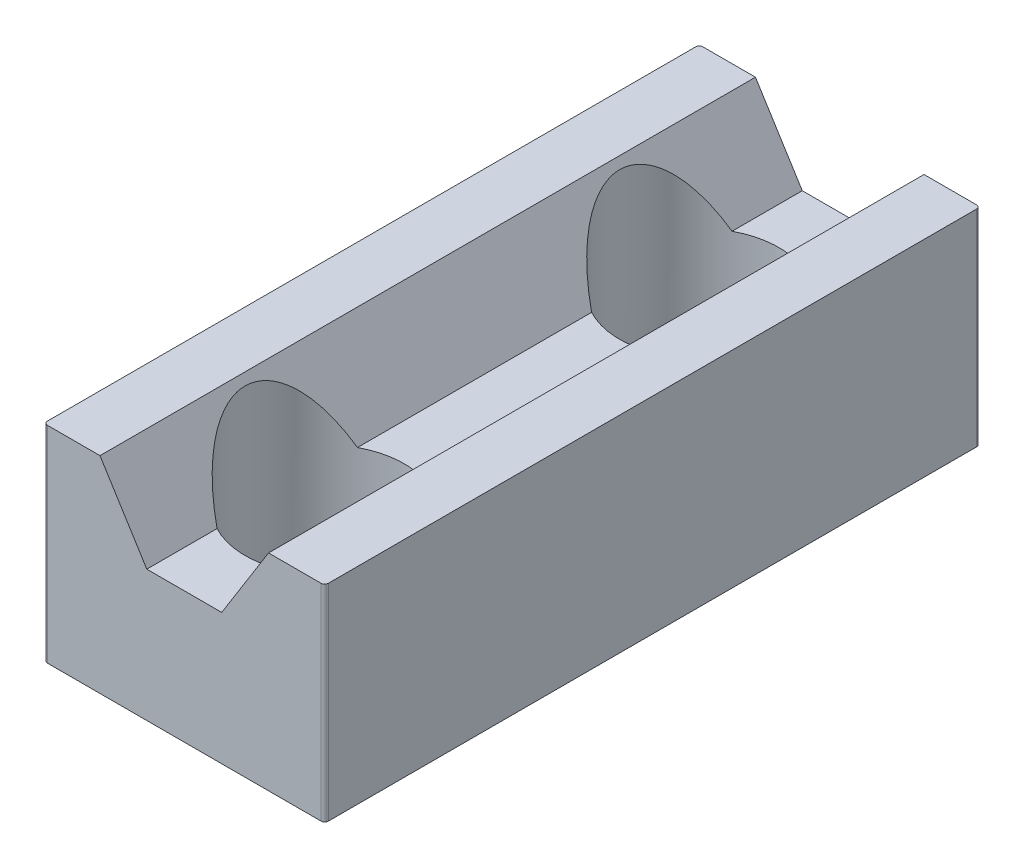
ISO-10303-21;
HEADER;
FILE_DESCRIPTION(('STEP AP214'),'2;1');
FILE_NAME('part.step','',(''),(''),'','','');
FILE_SCHEMA(('AUTOMOTIVE_DESIGN { 1 0 10303 214 1 1 1 1 }'));
ENDSEC;
DATA;
#1=APPLICATION_CONTEXT('core data for automotive mechanical design processes');
#2=APPLICATION_PROTOCOL_DEFINITION('international standard','automotive_design',2000,#1);
#3=PRODUCT_CONTEXT('',#1,'mechanical');
#4=PRODUCT('Part','Part','',(#3));
#5=PRODUCT_RELATED_PRODUCT_CATEGORY('part','',(#4));
#6=PRODUCT_DEFINITION_FORMATION('','',#4);
#7=PRODUCT_DEFINITION_CONTEXT('part definition',#1,'design');
#8=PRODUCT_DEFINITION('design','',#6,#7);
#9=PRODUCT_DEFINITION_SHAPE('','',#8);
#10=(LENGTH_UNIT() NAMED_UNIT(*) SI_UNIT(.MILLI.,.METRE.));
#11=(NAMED_UNIT(*) PLANE_ANGLE_UNIT() SI_UNIT($,.RADIAN.));
#12=(NAMED_UNIT(*) SI_UNIT($,.STERADIAN.) SOLID_ANGLE_UNIT());
#13=UNCERTAINTY_MEASURE_WITH_UNIT(LENGTH_MEASURE(1.E-05),#10,'distance_accuracy_value','');
#14=(GEOMETRIC_REPRESENTATION_CONTEXT(3) GLOBAL_UNCERTAINTY_ASSIGNED_CONTEXT((#13)) GLOBAL_UNIT_ASSIGNED_CONTEXT((#10,
#11,#12)) REPRESENTATION_CONTEXT('',''));
#15=CARTESIAN_POINT('',(0.,0.,0.));
#16=DIRECTION('',(0.,0.,1.));
#17=DIRECTION('',(1.,0.,0.));
#18=AXIS2_PLACEMENT_3D('',#15,#16,#17);
#19=CARTESIAN_POINT('',(0.,0.,0.));
#20=DIRECTION('',(0.,1.,0.));
#21=DIRECTION('',(1.,0.,0.));
#22=AXIS2_PLACEMENT_3D('',#19,#20,#21);
#23=PLANE('',#22);
#24=CARTESIAN_POINT('',(0.,0.,10.));
#25=DIRECTION('',(0.,1.,0.));
#26=DIRECTION('',(1.,0.,0.));
#27=AXIS2_PLACEMENT_3D('',#24,#25,#26);
#28=CIRCLE('',#27,2.75);
#29=CARTESIAN_POINT('',(-2.75,0.,10.));
#30=VERTEX_POINT('',#29);
#31=EDGE_CURVE('E25',#30,#30,#28,.T.);
#32=ORIENTED_EDGE('',*,*,#31,.T.);
#33=EDGE_LOOP('',(#32));
#34=FACE_BOUND('',#33,.T.);
#35=CARTESIAN_POINT('',(0.,0.,-10.));
#36=DIRECTION('',(0.,1.,0.));
#37=DIRECTION('',(1.,0.,0.));
#38=AXIS2_PLACEMENT_3D('',#35,#36,#37);
#39=CIRCLE('',#38,2.75);
#40=CARTESIAN_POINT('',(-2.75,0.,-10.));
#41=VERTEX_POINT('',#40);
#42=EDGE_CURVE('E257',#41,#41,#39,.T.);
#43=ORIENTED_EDGE('',*,*,#42,.T.);
#44=EDGE_LOOP('',(#43));
#45=FACE_BOUND('',#44,.T.);
#46=CARTESIAN_POINT('',(-7.3,0.,-17.3));
#47=DIRECTION('',(0.,1.,0.));
#48=DIRECTION('',(-0.707106781186548,0.,-0.707106781186548));
#49=AXIS2_PLACEMENT_3D('',#46,#47,#48);
#50=CIRCLE('',#49,0.2);
#51=CARTESIAN_POINT('',(-7.3,0.,-17.5));
#52=VERTEX_POINT('',#51);
#53=CARTESIAN_POINT('',(-7.5,0.,-17.3));
#54=VERTEX_POINT('',#53);
#55=EDGE_CURVE('E214',#52,#54,#50,.T.);
#56=ORIENTED_EDGE('',*,*,#55,.F.);
#57=DIRECTION('',(-1.,0.,0.));
#58=VECTOR('',#57,1.);
#59=CARTESIAN_POINT('',(7.5,0.,-17.5));
#60=LINE('',#59,#58);
#61=CARTESIAN_POINT('',(7.3,0.,-17.5));
#62=VERTEX_POINT('',#61);
#63=EDGE_CURVE('E198',#62,#52,#60,.T.);
#64=ORIENTED_EDGE('',*,*,#63,.F.);
#65=CARTESIAN_POINT('',(7.3,0.,-17.3));
#66=DIRECTION('',(0.,1.,0.));
#67=DIRECTION('',(0.707106781186548,0.,-0.707106781186548));
#68=AXIS2_PLACEMENT_3D('',#65,#66,#67);
#69=CIRCLE('',#68,0.2);
#70=CARTESIAN_POINT('',(7.5,0.,-17.3));
#71=VERTEX_POINT('',#70);
#72=EDGE_CURVE('E298',#71,#62,#69,.T.);
#73=ORIENTED_EDGE('',*,*,#72,.F.);
#74=DIRECTION('',(0.,0.,-1.));
#75=VECTOR('',#74,1.);
#76=CARTESIAN_POINT('',(7.5,0.,17.5));
#77=LINE('',#76,#75);
#78=CARTESIAN_POINT('',(7.5,0.,17.3));
#79=VERTEX_POINT('',#78);
#80=EDGE_CURVE('E305',#79,#71,#77,.T.);
#81=ORIENTED_EDGE('',*,*,#80,.F.);
#82=CARTESIAN_POINT('',(7.3,0.,17.3));
#83=DIRECTION('',(0.,1.,0.));
#84=DIRECTION('',(0.707106781186548,0.,0.707106781186548));
#85=AXIS2_PLACEMENT_3D('',#82,#83,#84);
#86=CIRCLE('',#85,0.2);
#87=CARTESIAN_POINT('',(7.3,0.,17.5));
#88=VERTEX_POINT('',#87);
#89=EDGE_CURVE('E265',#88,#79,#86,.T.);
#90=ORIENTED_EDGE('',*,*,#89,.F.);
#91=DIRECTION('',(1.,0.,0.));
#92=VECTOR('',#91,1.);
#93=CARTESIAN_POINT('',(-7.5,0.,17.5));
#94=LINE('',#93,#92);
#95=CARTESIAN_POINT('',(-7.3,0.,17.5));
#96=VERTEX_POINT('',#95);
#97=EDGE_CURVE('E285',#96,#88,#94,.T.);
#98=ORIENTED_EDGE('',*,*,#97,.F.);
#99=CARTESIAN_POINT('',(-7.3,0.,17.3));
#100=DIRECTION('',(0.,1.,0.));
#101=DIRECTION('',(-0.707106781186548,0.,0.707106781186548));
#102=AXIS2_PLACEMENT_3D('',#99,#100,#101);
#103=CIRCLE('',#102,0.2);
#104=CARTESIAN_POINT('',(-7.5,0.,17.3));
#105=VERTEX_POINT('',#104);
#106=EDGE_CURVE('E286',#105,#96,#103,.T.);
#107=ORIENTED_EDGE('',*,*,#106,.F.);
#108=DIRECTION('',(0.,0.,1.));
#109=VECTOR('',#108,1.);
#110=CARTESIAN_POINT('',(-7.5,0.,-17.5));
#111=LINE('',#110,#109);
#112=EDGE_CURVE('E11',#54,#105,#111,.T.);
#113=ORIENTED_EDGE('',*,*,#112,.F.);
#114=EDGE_LOOP('',(#56,#64,#73,#81,#90,#98,#107,#113));
#115=FACE_BOUND('',#114,.T.);
#116=ADVANCED_FACE('F17',(#34,#45,#115),#23,.F.);
#117=CARTESIAN_POINT('',(-7.5,0.,-17.5));
#118=DIRECTION('',(-1.,0.,0.));
#119=DIRECTION('',(0.,1.,0.));
#120=AXIS2_PLACEMENT_3D('',#117,#118,#119);
#121=PLANE('',#120);
#122=DIRECTION('',(0.,1.,0.));
#123=VECTOR('',#122,1.);
#124=CARTESIAN_POINT('',(-7.5,0.,-17.3));
#125=LINE('',#124,#123);
#126=CARTESIAN_POINT('',(-7.5,11.,-17.3));
#127=VERTEX_POINT('',#126);
#128=EDGE_CURVE('E220',#54,#127,#125,.T.);
#129=ORIENTED_EDGE('',*,*,#128,.F.);
#130=ORIENTED_EDGE('',*,*,#112,.T.);
#131=DIRECTION('',(0.,-1.,0.));
#132=VECTOR('',#131,1.);
#133=CARTESIAN_POINT('',(-7.5,0.,17.3));
#134=LINE('',#133,#132);
#135=CARTESIAN_POINT('',(-7.5,11.,17.3));
#136=VERTEX_POINT('',#135);
#137=EDGE_CURVE('E323',#136,#105,#134,.T.);
#138=ORIENTED_EDGE('',*,*,#137,.F.);
#139=DIRECTION('',(0.,0.,1.));
#140=VECTOR('',#139,1.);
#141=CARTESIAN_POINT('',(-7.5,11.,-17.5));
#142=LINE('',#141,#140);
#143=EDGE_CURVE('E211',#127,#136,#142,.T.);
#144=ORIENTED_EDGE('',*,*,#143,.F.);
#145=EDGE_LOOP('',(#129,#130,#138,#144));
#146=FACE_BOUND('',#145,.T.);
#147=ADVANCED_FACE('F880',(#146),#121,.T.);
#148=CARTESIAN_POINT('',(2.,7.,17.5));
#149=DIRECTION('',(0.,-1.,0.));
#150=DIRECTION('',(0.,0.,-1.));
#151=AXIS2_PLACEMENT_3D('',#148,#149,#150);
#152=PLANE('',#151);
#153=CARTESIAN_POINT('',(0.,7.,10.));
#154=DIRECTION('',(0.,-1.,0.));
#155=DIRECTION('',(1.,0.,0.));
#156=AXIS2_PLACEMENT_3D('',#153,#154,#155);
#157=CIRCLE('',#156,4.25);
#158=CARTESIAN_POINT('',(2.,7.,13.75));
#159=VERTEX_POINT('',#158);
#160=CARTESIAN_POINT('',(-2.,7.,13.75));
#161=VERTEX_POINT('',#160);
#162=EDGE_CURVE('E413',#159,#161,#157,.T.);
#163=ORIENTED_EDGE('',*,*,#162,.T.);
#164=DIRECTION('',(0.,0.,-1.));
#165=VECTOR('',#164,1.);
#166=CARTESIAN_POINT('',(-2.,7.,17.5));
#167=LINE('',#166,#165);
#168=CARTESIAN_POINT('',(-2.,7.,17.5));
#169=VERTEX_POINT('',#168);
#170=EDGE_CURVE('E324',#169,#161,#167,.T.);
#171=ORIENTED_EDGE('',*,*,#170,.F.);
#172=DIRECTION('',(-1.,0.,0.));
#173=VECTOR('',#172,1.);
#174=CARTESIAN_POINT('',(-2.75,7.,17.5));
#175=LINE('',#174,#173);
#176=CARTESIAN_POINT('',(2.,7.,17.5));
#177=VERTEX_POINT('',#176);
#178=EDGE_CURVE('E345',#177,#169,#175,.T.);
#179=ORIENTED_EDGE('',*,*,#178,.F.);
#180=DIRECTION('',(0.,0.,-1.));
#181=VECTOR('',#180,1.);
#182=CARTESIAN_POINT('',(2.,7.,17.5));
#183=LINE('',#182,#181);
#184=EDGE_CURVE('E239',#177,#159,#183,.T.);
#185=ORIENTED_EDGE('',*,*,#184,.T.);
#186=EDGE_LOOP('',(#163,#171,#179,#185));
#187=FACE_BOUND('',#186,.T.);
#188=ADVANCED_FACE('F870',(#187),#152,.F.);
#189=CARTESIAN_POINT('',(0.,11.,10.));
#190=DIRECTION('',(0.,-1.,0.));
#191=DIRECTION('',(1.,0.,0.));
#192=AXIS2_PLACEMENT_3D('',#189,#190,#191);
#193=CYLINDRICAL_SURFACE('',#192,2.75);
#194=CARTESIAN_POINT('',(0.,2.,10.));
#195=DIRECTION('',(0.,1.,0.));
#196=DIRECTION('',(1.,0.,0.));
#197=AXIS2_PLACEMENT_3D('',#194,#195,#196);
#198=CIRCLE('',#197,2.75);
#199=CARTESIAN_POINT('',(-2.75,2.,10.));
#200=VERTEX_POINT('',#199);
#201=EDGE_CURVE('E353',#200,#200,#198,.T.);
#202=ORIENTED_EDGE('',*,*,#201,.T.);
#203=DIRECTION('',(0.,-1.,0.));
#204=VECTOR('',#203,1.);
#205=CARTESIAN_POINT('',(-2.75,11.,10.));
#206=LINE('',#205,#204);
#207=EDGE_CURVE('E42',#200,#30,#206,.T.);
#208=ORIENTED_EDGE('',*,*,#207,.T.);
#209=ORIENTED_EDGE('',*,*,#31,.F.);
#210=ORIENTED_EDGE('',*,*,#207,.F.);
#211=EDGE_LOOP('',(#202,#208,#209,#210));
#212=FACE_BOUND('',#211,.T.);
#213=ADVANCED_FACE('F823',(#212),#193,.F.);
#214=CARTESIAN_POINT('',(0.,2.,10.));
#215=DIRECTION('',(0.,1.,0.));
#216=DIRECTION('',(1.,0.,0.));
#217=AXIS2_PLACEMENT_3D('',#214,#215,#216);
#218=PLANE('',#217);
#219=ORIENTED_EDGE('',*,*,#201,.F.);
#220=EDGE_LOOP('',(#219));
#221=FACE_BOUND('',#220,.T.);
#222=CARTESIAN_POINT('',(0.,2.,10.));
#223=DIRECTION('',(0.,-1.,0.));
#224=DIRECTION('',(1.,0.,0.));
#225=AXIS2_PLACEMENT_3D('',#222,#223,#224);
#226=CIRCLE('',#225,4.25);
#227=CARTESIAN_POINT('',(-4.25,2.,10.));
#228=VERTEX_POINT('',#227);
#229=EDGE_CURVE('E410',#228,#228,#226,.T.);
#230=ORIENTED_EDGE('',*,*,#229,.F.);
#231=EDGE_LOOP('',(#230));
#232=FACE_BOUND('',#231,.T.);
#233=ADVANCED_FACE('F818',(#221,#232),#218,.T.);
#234=CARTESIAN_POINT('',(0.,11.,10.));
#235=DIRECTION('',(0.,-1.,0.));
#236=DIRECTION('',(1.,0.,0.));
#237=AXIS2_PLACEMENT_3D('',#234,#235,#236);
#238=CYLINDRICAL_SURFACE('',#237,4.25);
#239=CARTESIAN_POINT('',(0.,3.8,10.));
#240=DIRECTION('',(0.847998304005088,-0.529998940003179,0.));
#241=DIRECTION('',(0.529998940003179,0.847998304005088,0.));
#242=AXIS2_PLACEMENT_3D('',#239,#240,#241);
#243=ELLIPSE('',#242,8.01888396224812,4.25);
#244=CARTESIAN_POINT('',(2.,7.,6.25));
#245=VERTEX_POINT('',#244);
#246=EDGE_CURVE('E244',#245,#159,#243,.T.);
#247=ORIENTED_EDGE('',*,*,#246,.F.);
#248=CARTESIAN_POINT('',(0.,7.,10.));
#249=DIRECTION('',(0.,-1.,0.));
#250=DIRECTION('',(1.,0.,0.));
#251=AXIS2_PLACEMENT_3D('',#248,#249,#250);
#252=CIRCLE('',#251,4.25);
#253=CARTESIAN_POINT('',(-2.,7.,6.25));
#254=VERTEX_POINT('',#253);
#255=EDGE_CURVE('E395',#254,#245,#252,.T.);
#256=ORIENTED_EDGE('',*,*,#255,.F.);
#257=CARTESIAN_POINT('',(0.,3.8,10.));
#258=DIRECTION('',(-0.847998304005088,-0.52999894000318,0.));
#259=DIRECTION('',(0.52999894000318,-0.847998304005088,0.));
#260=AXIS2_PLACEMENT_3D('',#257,#258,#259);
#261=ELLIPSE('',#260,8.01888396224811,4.25);
#262=CARTESIAN_POINT('',(-4.25,10.6,10.));
#263=VERTEX_POINT('',#262);
#264=EDGE_CURVE('E403',#263,#254,#261,.T.);
#265=ORIENTED_EDGE('',*,*,#264,.F.);
#266=DIRECTION('',(0.,-1.,0.));
#267=VECTOR('',#266,1.);
#268=CARTESIAN_POINT('',(-4.25,11.,10.));
#269=LINE('',#268,#267);
#270=EDGE_CURVE('E406',#263,#228,#269,.T.);
#271=ORIENTED_EDGE('',*,*,#270,.T.);
#272=ORIENTED_EDGE('',*,*,#229,.T.);
#273=ORIENTED_EDGE('',*,*,#270,.F.);
#274=CARTESIAN_POINT('',(0.,3.8,10.));
#275=DIRECTION('',(-0.847998304005088,-0.52999894000318,0.));
#276=DIRECTION('',(0.52999894000318,-0.847998304005088,0.));
#277=AXIS2_PLACEMENT_3D('',#274,#275,#276);
#278=ELLIPSE('',#277,8.01888396224811,4.25);
#279=EDGE_CURVE('E328',#161,#263,#278,.T.);
#280=ORIENTED_EDGE('',*,*,#279,.F.);
#281=ORIENTED_EDGE('',*,*,#162,.F.);
#282=EDGE_LOOP('',(#247,#256,#265,#271,#272,#273,#280,#281));
#283=FACE_BOUND('',#282,.T.);
#284=ADVANCED_FACE('F788',(#283),#238,.F.);
#285=CARTESIAN_POINT('',(-2.,7.,17.5));
#286=DIRECTION('',(-0.847998304005088,-0.52999894000318,0.));
#287=DIRECTION('',(-0.52999894000318,0.847998304005088,0.));
#288=AXIS2_PLACEMENT_3D('',#285,#286,#287);
#289=PLANE('',#288);
#290=CARTESIAN_POINT('',(0.,3.8,-10.));
#291=DIRECTION('',(-0.847998304005088,-0.52999894000318,0.));
#292=DIRECTION('',(0.52999894000318,-0.847998304005088,0.));
#293=AXIS2_PLACEMENT_3D('',#290,#291,#292);
#294=ELLIPSE('',#293,8.01888396224811,4.25);
#295=CARTESIAN_POINT('',(-2.,7.,-6.25));
#296=VERTEX_POINT('',#295);
#297=CARTESIAN_POINT('',(-4.25,10.6,-10.));
#298=VERTEX_POINT('',#297);
#299=EDGE_CURVE('E268',#296,#298,#294,.T.);
#300=ORIENTED_EDGE('',*,*,#299,.T.);
#301=CARTESIAN_POINT('',(0.,3.8,-10.));
#302=DIRECTION('',(-0.847998304005088,-0.52999894000318,0.));
#303=DIRECTION('',(0.52999894000318,-0.847998304005088,0.));
#304=AXIS2_PLACEMENT_3D('',#301,#302,#303);
#305=ELLIPSE('',#304,8.01888396224811,4.25);
#306=CARTESIAN_POINT('',(-2.,7.,-13.75));
#307=VERTEX_POINT('',#306);
#308=EDGE_CURVE('E369',#298,#307,#305,.T.);
#309=ORIENTED_EDGE('',*,*,#308,.T.);
#310=DIRECTION('',(0.,0.,-1.));
#311=VECTOR('',#310,1.);
#312=CARTESIAN_POINT('',(-2.,7.,17.5));
#313=LINE('',#312,#311);
#314=CARTESIAN_POINT('',(-2.,7.,-17.5));
#315=VERTEX_POINT('',#314);
#316=EDGE_CURVE('E329',#307,#315,#313,.T.);
#317=ORIENTED_EDGE('',*,*,#316,.T.);
#318=DIRECTION('',(0.52999894000318,-0.847998304005088,0.));
#319=VECTOR('',#318,1.);
#320=CARTESIAN_POINT('',(0.907303370786518,2.34831460674157,-17.5));
#321=LINE('',#320,#319);
#322=CARTESIAN_POINT('',(-4.5,11.,-17.5));
#323=VERTEX_POINT('',#322);
#324=EDGE_CURVE('E238',#323,#315,#321,.T.);
#325=ORIENTED_EDGE('',*,*,#324,.F.);
#326=DIRECTION('',(0.,0.,-1.));
#327=VECTOR('',#326,1.);
#328=CARTESIAN_POINT('',(-4.5,11.,8.75));
#329=LINE('',#328,#327);
#330=CARTESIAN_POINT('',(-4.5,11.,17.5));
#331=VERTEX_POINT('',#330);
#332=EDGE_CURVE('E278',#331,#323,#329,.T.);
#333=ORIENTED_EDGE('',*,*,#332,.F.);
#334=DIRECTION('',(-0.52999894000318,0.847998304005088,0.));
#335=VECTOR('',#334,1.);
#336=CARTESIAN_POINT('',(-1.19943820224719,5.71910112359551,17.5));
#337=LINE('',#336,#335);
#338=EDGE_CURVE('E269',#169,#331,#337,.T.);
#339=ORIENTED_EDGE('',*,*,#338,.F.);
#340=ORIENTED_EDGE('',*,*,#170,.T.);
#341=ORIENTED_EDGE('',*,*,#279,.T.);
#342=ORIENTED_EDGE('',*,*,#264,.T.);
#343=DIRECTION('',(0.,0.,-1.));
#344=VECTOR('',#343,1.);
#345=CARTESIAN_POINT('',(-2.,7.,17.5));
#346=LINE('',#345,#344);
#347=EDGE_CURVE('E392',#254,#296,#346,.T.);
#348=ORIENTED_EDGE('',*,*,#347,.T.);
#349=EDGE_LOOP('',(#300,#309,#317,#325,#333,#339,#340,#341,#342,#348));
#350=FACE_BOUND('',#349,.T.);
#351=ADVANCED_FACE('F687',(#350),#289,.F.);
#352=CARTESIAN_POINT('',(2.,7.,17.5));
#353=DIRECTION('',(0.,-1.,0.));
#354=DIRECTION('',(0.,0.,-1.));
#355=AXIS2_PLACEMENT_3D('',#352,#353,#354);
#356=PLANE('',#355);
#357=CARTESIAN_POINT('',(0.,7.,-10.));
#358=DIRECTION('',(0.,-1.,0.));
#359=DIRECTION('',(1.,0.,0.));
#360=AXIS2_PLACEMENT_3D('',#357,#358,#359);
#361=CIRCLE('',#360,4.25);
#362=CARTESIAN_POINT('',(2.,7.,-13.75));
#363=VERTEX_POINT('',#362);
#364=EDGE_CURVE('E365',#307,#363,#361,.T.);
#365=ORIENTED_EDGE('',*,*,#364,.T.);
#366=DIRECTION('',(0.,0.,-1.));
#367=VECTOR('',#366,1.);
#368=CARTESIAN_POINT('',(2.,7.,17.5));
#369=LINE('',#368,#367);
#370=CARTESIAN_POINT('',(2.,7.,-17.5));
#371=VERTEX_POINT('',#370);
#372=EDGE_CURVE('E243',#363,#371,#369,.T.);
#373=ORIENTED_EDGE('',*,*,#372,.T.);
#374=DIRECTION('',(1.,0.,0.));
#375=VECTOR('',#374,1.);
#376=CARTESIAN_POINT('',(4.75,7.,-17.5));
#377=LINE('',#376,#375);
#378=EDGE_CURVE('E233',#315,#371,#377,.T.);
#379=ORIENTED_EDGE('',*,*,#378,.F.);
#380=ORIENTED_EDGE('',*,*,#316,.F.);
#381=EDGE_LOOP('',(#365,#373,#379,#380));
#382=FACE_BOUND('',#381,.T.);
#383=ADVANCED_FACE('F681',(#382),#356,.F.);
#384=CARTESIAN_POINT('',(2.,7.,17.5));
#385=DIRECTION('',(0.,-1.,0.));
#386=DIRECTION('',(0.,0.,-1.));
#387=AXIS2_PLACEMENT_3D('',#384,#385,#386);
#388=PLANE('',#387);
#389=CARTESIAN_POINT('',(0.,7.,-10.));
#390=DIRECTION('',(0.,-1.,0.));
#391=DIRECTION('',(1.,0.,0.));
#392=AXIS2_PLACEMENT_3D('',#389,#390,#391);
#393=CIRCLE('',#392,4.25);
#394=CARTESIAN_POINT('',(2.,7.,-6.25));
#395=VERTEX_POINT('',#394);
#396=EDGE_CURVE('E357',#395,#296,#393,.T.);
#397=ORIENTED_EDGE('',*,*,#396,.T.);
#398=ORIENTED_EDGE('',*,*,#347,.F.);
#399=ORIENTED_EDGE('',*,*,#255,.T.);
#400=DIRECTION('',(0.,0.,-1.));
#401=VECTOR('',#400,1.);
#402=CARTESIAN_POINT('',(2.,7.,17.5));
#403=LINE('',#402,#401);
#404=EDGE_CURVE('E260',#245,#395,#403,.T.);
#405=ORIENTED_EDGE('',*,*,#404,.T.);
#406=EDGE_LOOP('',(#397,#398,#399,#405));
#407=FACE_BOUND('',#406,.T.);
#408=ADVANCED_FACE('F686',(#407),#388,.F.);
#409=CARTESIAN_POINT('',(4.5,11.,17.5));
#410=DIRECTION('',(0.847998304005089,-0.529998940003179,0.));
#411=DIRECTION('',(0.,0.,-1.));
#412=AXIS2_PLACEMENT_3D('',#409,#410,#411);
#413=PLANE('',#412);
#414=CARTESIAN_POINT('',(0.,3.8,-10.));
#415=DIRECTION('',(0.847998304005088,-0.529998940003179,0.));
#416=DIRECTION('',(0.529998940003179,0.847998304005088,0.));
#417=AXIS2_PLACEMENT_3D('',#414,#415,#416);
#418=ELLIPSE('',#417,8.01888396224812,4.25);
#419=EDGE_CURVE('E361',#363,#395,#418,.T.);
#420=ORIENTED_EDGE('',*,*,#419,.T.);
#421=ORIENTED_EDGE('',*,*,#404,.F.);
#422=ORIENTED_EDGE('',*,*,#246,.T.);
#423=ORIENTED_EDGE('',*,*,#184,.F.);
#424=DIRECTION('',(-0.529998940003179,-0.847998304005089,0.));
#425=VECTOR('',#424,1.);
#426=CARTESIAN_POINT('',(0.342696629213485,4.34831460674157,17.5));
#427=LINE('',#426,#425);
#428=CARTESIAN_POINT('',(4.5,11.,17.5));
#429=VERTEX_POINT('',#428);
#430=EDGE_CURVE('E341',#429,#177,#427,.T.);
#431=ORIENTED_EDGE('',*,*,#430,.F.);
#432=DIRECTION('',(0.,0.,1.));
#433=VECTOR('',#432,1.);
#434=CARTESIAN_POINT('',(4.5,11.,8.75));
#435=LINE('',#434,#433);
#436=CARTESIAN_POINT('',(4.5,11.,-17.5));
#437=VERTEX_POINT('',#436);
#438=EDGE_CURVE('E308',#437,#429,#435,.T.);
#439=ORIENTED_EDGE('',*,*,#438,.F.);
#440=DIRECTION('',(0.529998940003179,0.847998304005089,0.));
#441=VECTOR('',#440,1.);
#442=CARTESIAN_POINT('',(2.44943820224719,7.7191011235955,-17.5));
#443=LINE('',#442,#441);
#444=EDGE_CURVE('E237',#371,#437,#443,.T.);
#445=ORIENTED_EDGE('',*,*,#444,.F.);
#446=ORIENTED_EDGE('',*,*,#372,.F.);
#447=EDGE_LOOP('',(#420,#421,#422,#423,#431,#439,#445,#446));
#448=FACE_BOUND('',#447,.T.);
#449=ADVANCED_FACE('F706',(#448),#413,.F.);
#450=CARTESIAN_POINT('',(0.,11.,-10.));
#451=DIRECTION('',(0.,1.,0.));
#452=DIRECTION('',(1.,0.,0.));
#453=AXIS2_PLACEMENT_3D('',#450,#451,#452);
#454=CYLINDRICAL_SURFACE('',#453,2.75);
#455=CARTESIAN_POINT('',(0.,2.,-10.));
#456=DIRECTION('',(0.,1.,0.));
#457=DIRECTION('',(1.,0.,0.));
#458=AXIS2_PLACEMENT_3D('',#455,#456,#457);
#459=CIRCLE('',#458,2.75);
#460=CARTESIAN_POINT('',(-2.75,2.,-10.));
#461=VERTEX_POINT('',#460);
#462=EDGE_CURVE('E380',#461,#461,#459,.T.);
#463=ORIENTED_EDGE('',*,*,#462,.T.);
#464=DIRECTION('',(0.,-1.,0.));
#465=VECTOR('',#464,1.);
#466=CARTESIAN_POINT('',(-2.75,11.,-10.));
#467=LINE('',#466,#465);
#468=EDGE_CURVE('E261',#461,#41,#467,.T.);
#469=ORIENTED_EDGE('',*,*,#468,.T.);
#470=ORIENTED_EDGE('',*,*,#42,.F.);
#471=ORIENTED_EDGE('',*,*,#468,.F.);
#472=EDGE_LOOP('',(#463,#469,#470,#471));
#473=FACE_BOUND('',#472,.T.);
#474=ADVANCED_FACE('F711',(#473),#454,.F.);
#475=CARTESIAN_POINT('',(0.,2.,-10.));
#476=DIRECTION('',(0.,-1.,0.));
#477=DIRECTION('',(0.,0.,-1.));
#478=AXIS2_PLACEMENT_3D('',#475,#476,#477);
#479=PLANE('',#478);
#480=ORIENTED_EDGE('',*,*,#462,.F.);
#481=EDGE_LOOP('',(#480));
#482=FACE_BOUND('',#481,.T.);
#483=CARTESIAN_POINT('',(0.,2.,-10.));
#484=DIRECTION('',(0.,1.,0.));
#485=DIRECTION('',(1.,0.,0.));
#486=AXIS2_PLACEMENT_3D('',#483,#484,#485);
#487=CIRCLE('',#486,4.25);
#488=CARTESIAN_POINT('',(-4.25,2.,-10.));
#489=VERTEX_POINT('',#488);
#490=EDGE_CURVE('E377',#489,#489,#487,.T.);
#491=ORIENTED_EDGE('',*,*,#490,.T.);
#492=EDGE_LOOP('',(#491));
#493=FACE_BOUND('',#492,.T.);
#494=ADVANCED_FACE('F746',(#482,#493),#479,.F.);
#495=CARTESIAN_POINT('',(0.,11.,-10.));
#496=DIRECTION('',(0.,1.,0.));
#497=DIRECTION('',(1.,0.,0.));
#498=AXIS2_PLACEMENT_3D('',#495,#496,#497);
#499=CYLINDRICAL_SURFACE('',#498,4.25);
#500=ORIENTED_EDGE('',*,*,#299,.F.);
#501=ORIENTED_EDGE('',*,*,#396,.F.);
#502=ORIENTED_EDGE('',*,*,#419,.F.);
#503=ORIENTED_EDGE('',*,*,#364,.F.);
#504=ORIENTED_EDGE('',*,*,#308,.F.);
#505=DIRECTION('',(0.,-1.,0.));
#506=VECTOR('',#505,1.);
#507=CARTESIAN_POINT('',(-4.25,11.,-10.));
#508=LINE('',#507,#506);
#509=EDGE_CURVE('E373',#298,#489,#508,.T.);
#510=ORIENTED_EDGE('',*,*,#509,.T.);
#511=ORIENTED_EDGE('',*,*,#490,.F.);
#512=ORIENTED_EDGE('',*,*,#509,.F.);
#513=EDGE_LOOP('',(#500,#501,#502,#503,#504,#510,#511,#512));
#514=FACE_BOUND('',#513,.T.);
#515=ADVANCED_FACE('F810',(#514),#499,.F.);
#516=CARTESIAN_POINT('',(7.3,0.,17.3));
#517=DIRECTION('',(0.,1.,0.));
#518=DIRECTION('',(0.707106781186548,0.,0.707106781186548));
#519=AXIS2_PLACEMENT_3D('',#516,#517,#518);
#520=CYLINDRICAL_SURFACE('',#519,0.2);
#521=CARTESIAN_POINT('',(7.3,11.,17.3));
#522=DIRECTION('',(0.,-1.,0.));
#523=DIRECTION('',(0.707106781186548,0.,0.707106781186548));
#524=AXIS2_PLACEMENT_3D('',#521,#522,#523);
#525=CIRCLE('',#524,0.2);
#526=CARTESIAN_POINT('',(7.5,11.,17.3));
#527=VERTEX_POINT('',#526);
#528=CARTESIAN_POINT('',(7.3,11.,17.5));
#529=VERTEX_POINT('',#528);
#530=EDGE_CURVE('E319',#527,#529,#525,.T.);
#531=ORIENTED_EDGE('',*,*,#530,.T.);
#532=DIRECTION('',(0.,-1.,0.));
#533=VECTOR('',#532,1.);
#534=CARTESIAN_POINT('',(7.3,0.,17.5));
#535=LINE('',#534,#533);
#536=EDGE_CURVE('E294',#529,#88,#535,.T.);
#537=ORIENTED_EDGE('',*,*,#536,.T.);
#538=ORIENTED_EDGE('',*,*,#89,.T.);
#539=DIRECTION('',(0.,1.,0.));
#540=VECTOR('',#539,1.);
#541=CARTESIAN_POINT('',(7.5,0.,17.3));
#542=LINE('',#541,#540);
#543=EDGE_CURVE('E304',#79,#527,#542,.T.);
#544=ORIENTED_EDGE('',*,*,#543,.T.);
#545=EDGE_LOOP('',(#531,#537,#538,#544));
#546=FACE_BOUND('',#545,.T.);
#547=ADVANCED_FACE('F799',(#546),#520,.T.);
#548=CARTESIAN_POINT('',(-7.5,0.,17.5));
#549=DIRECTION('',(0.,0.,1.));
#550=DIRECTION('',(1.,0.,0.));
#551=AXIS2_PLACEMENT_3D('',#548,#549,#550);
#552=PLANE('',#551);
#553=DIRECTION('',(0.,1.,0.));
#554=VECTOR('',#553,1.);
#555=CARTESIAN_POINT('',(-7.3,0.,17.5));
#556=LINE('',#555,#554);
#557=CARTESIAN_POINT('',(-7.3,11.,17.5));
#558=VERTEX_POINT('',#557);
#559=EDGE_CURVE('E282',#96,#558,#556,.T.);
#560=ORIENTED_EDGE('',*,*,#559,.F.);
#561=ORIENTED_EDGE('',*,*,#97,.T.);
#562=ORIENTED_EDGE('',*,*,#536,.F.);
#563=DIRECTION('',(1.,0.,0.));
#564=VECTOR('',#563,1.);
#565=CARTESIAN_POINT('',(-7.5,11.,17.5));
#566=LINE('',#565,#564);
#567=EDGE_CURVE('E315',#429,#529,#566,.T.);
#568=ORIENTED_EDGE('',*,*,#567,.F.);
#569=ORIENTED_EDGE('',*,*,#430,.T.);
#570=ORIENTED_EDGE('',*,*,#178,.T.);
#571=ORIENTED_EDGE('',*,*,#338,.T.);
#572=DIRECTION('',(1.,0.,0.));
#573=VECTOR('',#572,1.);
#574=CARTESIAN_POINT('',(-7.5,11.,17.5));
#575=LINE('',#574,#573);
#576=EDGE_CURVE('E256',#558,#331,#575,.T.);
#577=ORIENTED_EDGE('',*,*,#576,.F.);
#578=EDGE_LOOP('',(#560,#561,#562,#568,#569,#570,#571,#577));
#579=FACE_BOUND('',#578,.T.);
#580=ADVANCED_FACE('F777',(#579),#552,.T.);
#581=CARTESIAN_POINT('',(-7.3,0.,17.3));
#582=DIRECTION('',(0.,1.,0.));
#583=DIRECTION('',(-0.707106781186548,0.,0.707106781186548));
#584=AXIS2_PLACEMENT_3D('',#581,#582,#583);
#585=CYLINDRICAL_SURFACE('',#584,0.2);
#586=CARTESIAN_POINT('',(-7.3,11.,17.3));
#587=DIRECTION('',(0.,-1.,0.));
#588=DIRECTION('',(-0.707106781186548,0.,0.707106781186548));
#589=AXIS2_PLACEMENT_3D('',#586,#587,#588);
#590=CIRCLE('',#589,0.2);
#591=EDGE_CURVE('E252',#558,#136,#590,.T.);
#592=ORIENTED_EDGE('',*,*,#591,.T.);
#593=ORIENTED_EDGE('',*,*,#137,.T.);
#594=ORIENTED_EDGE('',*,*,#106,.T.);
#595=ORIENTED_EDGE('',*,*,#559,.T.);
#596=EDGE_LOOP('',(#592,#593,#594,#595));
#597=FACE_BOUND('',#596,.T.);
#598=ADVANCED_FACE('F766',(#597),#585,.T.);
#599=CARTESIAN_POINT('',(0.,11.,0.));
#600=DIRECTION('',(0.,1.,0.));
#601=DIRECTION('',(1.,0.,0.));
#602=AXIS2_PLACEMENT_3D('',#599,#600,#601);
#603=PLANE('',#602);
#604=CARTESIAN_POINT('',(7.3,11.,-17.3));
#605=DIRECTION('',(0.,-1.,0.));
#606=DIRECTION('',(0.707106781186548,0.,-0.707106781186548));
#607=AXIS2_PLACEMENT_3D('',#604,#605,#606);
#608=CIRCLE('',#607,0.2);
#609=CARTESIAN_POINT('',(7.3,11.,-17.5));
#610=VERTEX_POINT('',#609);
#611=CARTESIAN_POINT('',(7.5,11.,-17.3));
#612=VERTEX_POINT('',#611);
#613=EDGE_CURVE('E281',#610,#612,#608,.T.);
#614=ORIENTED_EDGE('',*,*,#613,.F.);
#615=DIRECTION('',(-1.,0.,0.));
#616=VECTOR('',#615,1.);
#617=CARTESIAN_POINT('',(7.5,11.,-17.5));
#618=LINE('',#617,#616);
#619=EDGE_CURVE('E245',#610,#437,#618,.T.);
#620=ORIENTED_EDGE('',*,*,#619,.T.);
#621=ORIENTED_EDGE('',*,*,#438,.T.);
#622=ORIENTED_EDGE('',*,*,#567,.T.);
#623=ORIENTED_EDGE('',*,*,#530,.F.);
#624=DIRECTION('',(0.,0.,-1.));
#625=VECTOR('',#624,1.);
#626=CARTESIAN_POINT('',(7.5,11.,17.5));
#627=LINE('',#626,#625);
#628=EDGE_CURVE('E301',#527,#612,#627,.T.);
#629=ORIENTED_EDGE('',*,*,#628,.T.);
#630=EDGE_LOOP('',(#614,#620,#621,#622,#623,#629));
#631=FACE_BOUND('',#630,.T.);
#632=ADVANCED_FACE('F725',(#631),#603,.T.);
#633=CARTESIAN_POINT('',(7.5,0.,17.5));
#634=DIRECTION('',(1.,0.,0.));
#635=DIRECTION('',(0.,0.,-1.));
#636=AXIS2_PLACEMENT_3D('',#633,#634,#635);
#637=PLANE('',#636);
#638=DIRECTION('',(0.,-1.,0.));
#639=VECTOR('',#638,1.);
#640=CARTESIAN_POINT('',(7.5,0.,-17.3));
#641=LINE('',#640,#639);
#642=EDGE_CURVE('E290',#612,#71,#641,.T.);
#643=ORIENTED_EDGE('',*,*,#642,.F.);
#644=ORIENTED_EDGE('',*,*,#628,.F.);
#645=ORIENTED_EDGE('',*,*,#543,.F.);
#646=ORIENTED_EDGE('',*,*,#80,.T.);
#647=EDGE_LOOP('',(#643,#644,#645,#646));
#648=FACE_BOUND('',#647,.T.);
#649=ADVANCED_FACE('F719',(#648),#637,.T.);
#650=CARTESIAN_POINT('',(7.3,0.,-17.3));
#651=DIRECTION('',(0.,1.,0.));
#652=DIRECTION('',(0.707106781186548,0.,-0.707106781186548));
#653=AXIS2_PLACEMENT_3D('',#650,#651,#652);
#654=CYLINDRICAL_SURFACE('',#653,0.2);
#655=ORIENTED_EDGE('',*,*,#613,.T.);
#656=ORIENTED_EDGE('',*,*,#642,.T.);
#657=ORIENTED_EDGE('',*,*,#72,.T.);
#658=DIRECTION('',(0.,1.,0.));
#659=VECTOR('',#658,1.);
#660=CARTESIAN_POINT('',(7.3,0.,-17.5));
#661=LINE('',#660,#659);
#662=EDGE_CURVE('E207',#62,#610,#661,.T.);
#663=ORIENTED_EDGE('',*,*,#662,.T.);
#664=EDGE_LOOP('',(#655,#656,#657,#663));
#665=FACE_BOUND('',#664,.T.);
#666=ADVANCED_FACE('F724',(#665),#654,.T.);
#667=CARTESIAN_POINT('',(0.,11.,0.));
#668=DIRECTION('',(0.,1.,0.));
#669=DIRECTION('',(1.,0.,0.));
#670=AXIS2_PLACEMENT_3D('',#667,#668,#669);
#671=PLANE('',#670);
#672=CARTESIAN_POINT('',(-7.3,11.,-17.3));
#673=DIRECTION('',(0.,-1.,0.));
#674=DIRECTION('',(-0.707106781186548,0.,-0.707106781186548));
#675=AXIS2_PLACEMENT_3D('',#672,#673,#674);
#676=CIRCLE('',#675,0.2);
#677=CARTESIAN_POINT('',(-7.3,11.,-17.5));
#678=VERTEX_POINT('',#677);
#679=EDGE_CURVE('E224',#127,#678,#676,.T.);
#680=ORIENTED_EDGE('',*,*,#679,.F.);
#681=ORIENTED_EDGE('',*,*,#143,.T.);
#682=ORIENTED_EDGE('',*,*,#591,.F.);
#683=ORIENTED_EDGE('',*,*,#576,.T.);
#684=ORIENTED_EDGE('',*,*,#332,.T.);
#685=DIRECTION('',(-1.,0.,0.));
#686=VECTOR('',#685,1.);
#687=CARTESIAN_POINT('',(7.5,11.,-17.5));
#688=LINE('',#687,#686);
#689=EDGE_CURVE('E264',#323,#678,#688,.T.);
#690=ORIENTED_EDGE('',*,*,#689,.T.);
#691=EDGE_LOOP('',(#680,#681,#682,#683,#684,#690));
#692=FACE_BOUND('',#691,.T.);
#693=ADVANCED_FACE('F699',(#692),#671,.T.);
#694=CARTESIAN_POINT('',(7.5,0.,-17.5));
#695=DIRECTION('',(0.,0.,-1.));
#696=DIRECTION('',(0.,-1.,0.));
#697=AXIS2_PLACEMENT_3D('',#694,#695,#696);
#698=PLANE('',#697);
#699=DIRECTION('',(0.,-1.,0.));
#700=VECTOR('',#699,1.);
#701=CARTESIAN_POINT('',(-7.3,0.,-17.5));
#702=LINE('',#701,#700);
#703=EDGE_CURVE('E203',#678,#52,#702,.T.);
#704=ORIENTED_EDGE('',*,*,#703,.F.);
#705=ORIENTED_EDGE('',*,*,#689,.F.);
#706=ORIENTED_EDGE('',*,*,#324,.T.);
#707=ORIENTED_EDGE('',*,*,#378,.T.);
#708=ORIENTED_EDGE('',*,*,#444,.T.);
#709=ORIENTED_EDGE('',*,*,#619,.F.);
#710=ORIENTED_EDGE('',*,*,#662,.F.);
#711=ORIENTED_EDGE('',*,*,#63,.T.);
#712=EDGE_LOOP('',(#704,#705,#706,#707,#708,#709,#710,#711));
#713=FACE_BOUND('',#712,.T.);
#714=ADVANCED_FACE('F200',(#713),#698,.T.);
#715=CARTESIAN_POINT('',(-7.3,0.,-17.3));
#716=DIRECTION('',(0.,1.,0.));
#717=DIRECTION('',(-0.707106781186548,0.,-0.707106781186548));
#718=AXIS2_PLACEMENT_3D('',#715,#716,#717);
#719=CYLINDRICAL_SURFACE('',#718,0.2);
#720=ORIENTED_EDGE('',*,*,#679,.T.);
#721=ORIENTED_EDGE('',*,*,#703,.T.);
#722=ORIENTED_EDGE('',*,*,#55,.T.);
#723=ORIENTED_EDGE('',*,*,#128,.T.);
#724=EDGE_LOOP('',(#720,#721,#722,#723));
#725=FACE_BOUND('',#724,.T.);
#726=ADVANCED_FACE('F222',(#725),#719,.T.);
#727=CLOSED_SHELL('',(#116,#147,#188,#213,#233,#284,#351,#383,#408,#449,#474,#494,#515,#547,
#580,#598,#632,#649,#666,#693,#714,#726));
#728=MANIFOLD_SOLID_BREP('B1',#727);
#729=ADVANCED_BREP_SHAPE_REPRESENTATION('',(#18,#728),#14);
#730=SHAPE_DEFINITION_REPRESENTATION(#9,#729);
ENDSEC;
END-ISO-10303-21;
